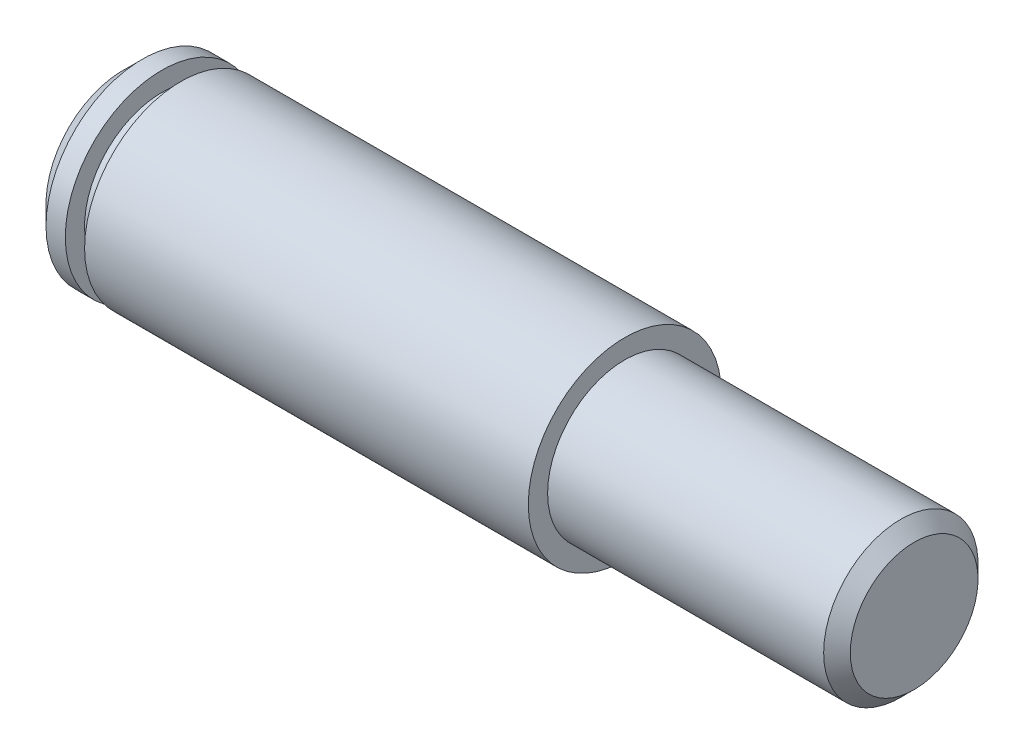
ISO-10303-21;
HEADER;
FILE_DESCRIPTION(('STEP AP214'),'2;1');
FILE_NAME('part.step','',(''),(''),'','','');
FILE_SCHEMA(('AUTOMOTIVE_DESIGN { 1 0 10303 214 1 1 1 1 }'));
ENDSEC;
DATA;
#1=APPLICATION_CONTEXT('core data for automotive mechanical design processes');
#2=APPLICATION_PROTOCOL_DEFINITION('international standard','automotive_design',2000,#1);
#3=PRODUCT_CONTEXT('',#1,'mechanical');
#4=PRODUCT('Part','Part','',(#3));
#5=PRODUCT_RELATED_PRODUCT_CATEGORY('part','',(#4));
#6=PRODUCT_DEFINITION_FORMATION('','',#4);
#7=PRODUCT_DEFINITION_CONTEXT('part definition',#1,'design');
#8=PRODUCT_DEFINITION('design','',#6,#7);
#9=PRODUCT_DEFINITION_SHAPE('','',#8);
#10=(LENGTH_UNIT() NAMED_UNIT(*) SI_UNIT(.MILLI.,.METRE.));
#11=(NAMED_UNIT(*) PLANE_ANGLE_UNIT() SI_UNIT($,.RADIAN.));
#12=(NAMED_UNIT(*) SI_UNIT($,.STERADIAN.) SOLID_ANGLE_UNIT());
#13=UNCERTAINTY_MEASURE_WITH_UNIT(LENGTH_MEASURE(1.E-05),#10,'distance_accuracy_value','');
#14=(GEOMETRIC_REPRESENTATION_CONTEXT(3) GLOBAL_UNCERTAINTY_ASSIGNED_CONTEXT((#13)) GLOBAL_UNIT_ASSIGNED_CONTEXT((#10,
#11,#12)) REPRESENTATION_CONTEXT('',''));
#15=CARTESIAN_POINT('',(0.,0.,0.));
#16=DIRECTION('',(0.,0.,1.));
#17=DIRECTION('',(1.,0.,0.));
#18=AXIS2_PLACEMENT_3D('',#15,#16,#17);
#19=CARTESIAN_POINT('',(0.,0.,0.));
#20=DIRECTION('',(-1.,0.,0.));
#21=DIRECTION('',(0.,0.,1.));
#22=AXIS2_PLACEMENT_3D('',#19,#20,#21);
#23=PLANE('',#22);
#24=CARTESIAN_POINT('',(0.,0.,0.));
#25=DIRECTION('',(1.,0.,0.));
#26=DIRECTION('',(0.,0.,-1.));
#27=AXIS2_PLACEMENT_3D('',#24,#25,#26);
#28=CIRCLE('',#27,4.);
#29=CARTESIAN_POINT('',(0.,0.,-4.));
#30=VERTEX_POINT('',#29);
#31=EDGE_CURVE('E10',#30,#30,#28,.T.);
#32=ORIENTED_EDGE('',*,*,#31,.F.);
#33=EDGE_LOOP('',(#32));
#34=FACE_BOUND('',#33,.T.);
#35=ADVANCED_FACE('F42',(#34),#23,.T.);
#36=CARTESIAN_POINT('',(1.,0.,0.));
#37=DIRECTION('',(1.,0.,0.));
#38=DIRECTION('',(0.,0.,-1.));
#39=AXIS2_PLACEMENT_3D('',#36,#37,#38);
#40=CONICAL_SURFACE('',#39,4.99999999999999,0.785398163397445);
#41=ORIENTED_EDGE('',*,*,#31,.T.);
#42=EDGE_LOOP('',(#41));
#43=FACE_BOUND('',#42,.T.);
#44=CARTESIAN_POINT('',(1.,0.,0.));
#45=DIRECTION('',(1.,0.,0.));
#46=DIRECTION('',(0.,0.,-1.));
#47=AXIS2_PLACEMENT_3D('',#44,#45,#46);
#48=CIRCLE('',#47,4.99999999999999);
#49=CARTESIAN_POINT('',(1.,0.,-4.99999999999999));
#50=VERTEX_POINT('',#49);
#51=EDGE_CURVE('E49',#50,#50,#48,.T.);
#52=ORIENTED_EDGE('',*,*,#51,.F.);
#53=EDGE_LOOP('',(#52));
#54=FACE_BOUND('',#53,.T.);
#55=ADVANCED_FACE('F109',(#43,#54),#40,.T.);
#56=CARTESIAN_POINT('',(41.,0.,0.));
#57=DIRECTION('',(1.,0.,0.));
#58=DIRECTION('',(0.,0.,-1.));
#59=AXIS2_PLACEMENT_3D('',#56,#57,#58);
#60=CYLINDRICAL_SURFACE('',#59,4.99999999999999);
#61=ORIENTED_EDGE('',*,*,#51,.T.);
#62=EDGE_LOOP('',(#61));
#63=FACE_BOUND('',#62,.T.);
#64=CARTESIAN_POINT('',(2.,0.,0.));
#65=DIRECTION('',(1.,0.,0.));
#66=DIRECTION('',(0.,0.,-1.));
#67=AXIS2_PLACEMENT_3D('',#64,#65,#66);
#68=CIRCLE('',#67,4.99999999999999);
#69=CARTESIAN_POINT('',(2.,0.,-4.99999999999999));
#70=VERTEX_POINT('',#69);
#71=EDGE_CURVE('E55',#70,#70,#68,.T.);
#72=ORIENTED_EDGE('',*,*,#71,.F.);
#73=EDGE_LOOP('',(#72));
#74=FACE_BOUND('',#73,.T.);
#75=ADVANCED_FACE('F114',(#63,#74),#60,.T.);
#76=CARTESIAN_POINT('',(2.,0.,-4.99999999999999));
#77=DIRECTION('',(1.,0.,0.));
#78=DIRECTION('',(0.,0.,-1.));
#79=AXIS2_PLACEMENT_3D('',#76,#77,#78);
#80=PLANE('',#79);
#81=ORIENTED_EDGE('',*,*,#71,.T.);
#82=EDGE_LOOP('',(#81));
#83=FACE_BOUND('',#82,.T.);
#84=CARTESIAN_POINT('',(2.,0.,0.));
#85=DIRECTION('',(1.,0.,0.));
#86=DIRECTION('',(0.,0.,-1.));
#87=AXIS2_PLACEMENT_3D('',#84,#85,#86);
#88=CIRCLE('',#87,3.99999999999999);
#89=CARTESIAN_POINT('',(2.,0.,-3.99999999999999));
#90=VERTEX_POINT('',#89);
#91=EDGE_CURVE('E61',#90,#90,#88,.T.);
#92=ORIENTED_EDGE('',*,*,#91,.F.);
#93=EDGE_LOOP('',(#92));
#94=FACE_BOUND('',#93,.T.);
#95=ADVANCED_FACE('F118',(#83,#94),#80,.T.);
#96=CARTESIAN_POINT('',(41.,0.,0.));
#97=DIRECTION('',(1.,0.,0.));
#98=DIRECTION('',(0.,0.,-1.));
#99=AXIS2_PLACEMENT_3D('',#96,#97,#98);
#100=CYLINDRICAL_SURFACE('',#99,3.99999999999999);
#101=ORIENTED_EDGE('',*,*,#91,.T.);
#102=EDGE_LOOP('',(#101));
#103=FACE_BOUND('',#102,.T.);
#104=CARTESIAN_POINT('',(3.,0.,0.));
#105=DIRECTION('',(1.,0.,0.));
#106=DIRECTION('',(0.,0.,-1.));
#107=AXIS2_PLACEMENT_3D('',#104,#105,#106);
#108=CIRCLE('',#107,3.99999999999999);
#109=CARTESIAN_POINT('',(3.,0.,-3.99999999999999));
#110=VERTEX_POINT('',#109);
#111=EDGE_CURVE('E67',#110,#110,#108,.T.);
#112=ORIENTED_EDGE('',*,*,#111,.F.);
#113=EDGE_LOOP('',(#112));
#114=FACE_BOUND('',#113,.T.);
#115=ADVANCED_FACE('F124',(#103,#114),#100,.T.);
#116=CARTESIAN_POINT('',(3.,0.,-3.99999999999999));
#117=DIRECTION('',(-1.,0.,0.));
#118=DIRECTION('',(0.,0.,1.));
#119=AXIS2_PLACEMENT_3D('',#116,#117,#118);
#120=PLANE('',#119);
#121=ORIENTED_EDGE('',*,*,#111,.T.);
#122=EDGE_LOOP('',(#121));
#123=FACE_BOUND('',#122,.T.);
#124=CARTESIAN_POINT('',(3.,0.,0.));
#125=DIRECTION('',(1.,0.,0.));
#126=DIRECTION('',(0.,0.,-1.));
#127=AXIS2_PLACEMENT_3D('',#124,#125,#126);
#128=CIRCLE('',#127,4.99999999999999);
#129=CARTESIAN_POINT('',(3.,0.,-4.99999999999999));
#130=VERTEX_POINT('',#129);
#131=EDGE_CURVE('E71',#130,#130,#128,.T.);
#132=ORIENTED_EDGE('',*,*,#131,.F.);
#133=EDGE_LOOP('',(#132));
#134=FACE_BOUND('',#133,.T.);
#135=ADVANCED_FACE('F128',(#123,#134),#120,.T.);
#136=CARTESIAN_POINT('',(41.,0.,0.));
#137=DIRECTION('',(1.,0.,0.));
#138=DIRECTION('',(0.,0.,-1.));
#139=AXIS2_PLACEMENT_3D('',#136,#137,#138);
#140=CYLINDRICAL_SURFACE('',#139,4.99999999999999);
#141=ORIENTED_EDGE('',*,*,#131,.T.);
#142=EDGE_LOOP('',(#141));
#143=FACE_BOUND('',#142,.T.);
#144=CARTESIAN_POINT('',(26.,0.,0.));
#145=DIRECTION('',(1.,0.,0.));
#146=DIRECTION('',(0.,0.,-1.));
#147=AXIS2_PLACEMENT_3D('',#144,#145,#146);
#148=CIRCLE('',#147,5.);
#149=CARTESIAN_POINT('',(26.,0.,-5.));
#150=VERTEX_POINT('',#149);
#151=EDGE_CURVE('E75',#150,#150,#148,.T.);
#152=ORIENTED_EDGE('',*,*,#151,.F.);
#153=EDGE_LOOP('',(#152));
#154=FACE_BOUND('',#153,.T.);
#155=ADVANCED_FACE('F132',(#143,#154),#140,.T.);
#156=CARTESIAN_POINT('',(26.,0.,-4.99999999999999));
#157=DIRECTION('',(1.,0.,0.));
#158=DIRECTION('',(0.,0.,-1.));
#159=AXIS2_PLACEMENT_3D('',#156,#157,#158);
#160=PLANE('',#159);
#161=ORIENTED_EDGE('',*,*,#151,.T.);
#162=EDGE_LOOP('',(#161));
#163=FACE_BOUND('',#162,.T.);
#164=CARTESIAN_POINT('',(26.,0.,0.));
#165=DIRECTION('',(-1.,0.,0.));
#166=DIRECTION('',(0.,0.,1.));
#167=AXIS2_PLACEMENT_3D('',#164,#165,#166);
#168=CIRCLE('',#167,4.);
#169=CARTESIAN_POINT('',(26.,0.,4.));
#170=VERTEX_POINT('',#169);
#171=EDGE_CURVE('E79',#170,#170,#168,.T.);
#172=ORIENTED_EDGE('',*,*,#171,.T.);
#173=EDGE_LOOP('',(#172));
#174=FACE_BOUND('',#173,.T.);
#175=ADVANCED_FACE('F135',(#163,#174),#160,.T.);
#176=CARTESIAN_POINT('',(41.,0.,0.));
#177=DIRECTION('',(-1.,0.,0.));
#178=DIRECTION('',(0.,0.,1.));
#179=AXIS2_PLACEMENT_3D('',#176,#177,#178);
#180=CYLINDRICAL_SURFACE('',#179,4.);
#181=ORIENTED_EDGE('',*,*,#171,.F.);
#182=EDGE_LOOP('',(#181));
#183=FACE_BOUND('',#182,.T.);
#184=CARTESIAN_POINT('',(40.3095,0.,0.));
#185=DIRECTION('',(-1.,0.,0.));
#186=DIRECTION('',(0.,0.,1.));
#187=AXIS2_PLACEMENT_3D('',#184,#185,#186);
#188=CIRCLE('',#187,4.);
#189=CARTESIAN_POINT('',(40.3095,0.,4.));
#190=VERTEX_POINT('',#189);
#191=EDGE_CURVE('E87',#190,#190,#188,.T.);
#192=ORIENTED_EDGE('',*,*,#191,.T.);
#193=EDGE_LOOP('',(#192));
#194=FACE_BOUND('',#193,.T.);
#195=ADVANCED_FACE('F93',(#183,#194),#180,.T.);
#196=CARTESIAN_POINT('',(41.,0.,0.));
#197=DIRECTION('',(-1.,0.,0.));
#198=DIRECTION('',(0.,0.,1.));
#199=AXIS2_PLACEMENT_3D('',#196,#197,#198);
#200=CONICAL_SURFACE('',#199,3.3095,0.785398163397457);
#201=ORIENTED_EDGE('',*,*,#191,.F.);
#202=EDGE_LOOP('',(#201));
#203=FACE_BOUND('',#202,.T.);
#204=CARTESIAN_POINT('',(41.,0.,0.));
#205=DIRECTION('',(-1.,0.,0.));
#206=DIRECTION('',(0.,0.,1.));
#207=AXIS2_PLACEMENT_3D('',#204,#205,#206);
#208=CIRCLE('',#207,3.3095);
#209=CARTESIAN_POINT('',(41.,0.,3.3095));
#210=VERTEX_POINT('',#209);
#211=EDGE_CURVE('E83',#210,#210,#208,.T.);
#212=ORIENTED_EDGE('',*,*,#211,.T.);
#213=EDGE_LOOP('',(#212));
#214=FACE_BOUND('',#213,.T.);
#215=ADVANCED_FACE('F95',(#203,#214),#200,.T.);
#216=CARTESIAN_POINT('',(41.,0.,-4.25));
#217=DIRECTION('',(1.,0.,0.));
#218=DIRECTION('',(0.,0.,-1.));
#219=AXIS2_PLACEMENT_3D('',#216,#217,#218);
#220=PLANE('',#219);
#221=ORIENTED_EDGE('',*,*,#211,.F.);
#222=EDGE_LOOP('',(#221));
#223=FACE_BOUND('',#222,.T.);
#224=ADVANCED_FACE('F98',(#223),#220,.T.);
#225=CLOSED_SHELL('',(#35,#55,#75,#95,#115,#135,#155,#175,#195,#215,#224));
#226=MANIFOLD_SOLID_BREP('B2',#225);
#227=ADVANCED_BREP_SHAPE_REPRESENTATION('',(#18,#226),#14);
#228=SHAPE_DEFINITION_REPRESENTATION(#9,#227);
ENDSEC;
END-ISO-10303-21;
